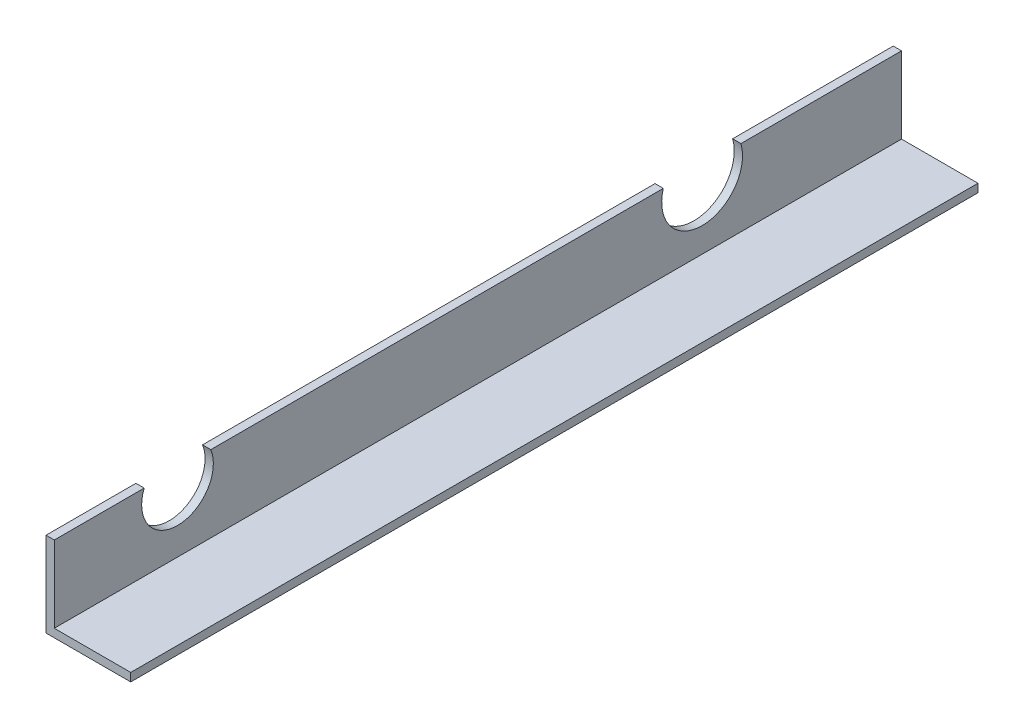
ISO-10303-21;
HEADER;
FILE_DESCRIPTION(('STEP AP214'),'2;1');
FILE_NAME('part.step','',(''),(''),'','','');
FILE_SCHEMA(('AUTOMOTIVE_DESIGN { 1 0 10303 214 1 1 1 1 }'));
ENDSEC;
DATA;
#1=APPLICATION_CONTEXT('core data for automotive mechanical design processes');
#2=APPLICATION_PROTOCOL_DEFINITION('international standard','automotive_design',2000,#1);
#3=PRODUCT_CONTEXT('',#1,'mechanical');
#4=PRODUCT('Part','Part','',(#3));
#5=PRODUCT_RELATED_PRODUCT_CATEGORY('part','',(#4));
#6=PRODUCT_DEFINITION_FORMATION('','',#4);
#7=PRODUCT_DEFINITION_CONTEXT('part definition',#1,'design');
#8=PRODUCT_DEFINITION('design','',#6,#7);
#9=PRODUCT_DEFINITION_SHAPE('','',#8);
#10=(LENGTH_UNIT() NAMED_UNIT(*) SI_UNIT(.MILLI.,.METRE.));
#11=(NAMED_UNIT(*) PLANE_ANGLE_UNIT() SI_UNIT($,.RADIAN.));
#12=(NAMED_UNIT(*) SI_UNIT($,.STERADIAN.) SOLID_ANGLE_UNIT());
#13=UNCERTAINTY_MEASURE_WITH_UNIT(LENGTH_MEASURE(1.E-05),#10,'distance_accuracy_value','');
#14=(GEOMETRIC_REPRESENTATION_CONTEXT(3) GLOBAL_UNCERTAINTY_ASSIGNED_CONTEXT((#13)) GLOBAL_UNIT_ASSIGNED_CONTEXT((#10,
#11,#12)) REPRESENTATION_CONTEXT('',''));
#15=CARTESIAN_POINT('',(0.,0.,0.));
#16=DIRECTION('',(0.,0.,1.));
#17=DIRECTION('',(1.,0.,0.));
#18=AXIS2_PLACEMENT_3D('',#15,#16,#17);
#19=CARTESIAN_POINT('',(6.35,6.35,325.));
#20=DIRECTION('',(-1.,0.,0.));
#21=DIRECTION('',(0.,0.,1.));
#22=AXIS2_PLACEMENT_3D('',#19,#20,#21);
#23=PLANE('',#22);
#24=CARTESIAN_POINT('',(6.34999999999985,56.3500000000004,-172.));
#25=DIRECTION('',(1.,0.,0.));
#26=DIRECTION('',(0.,0.,-1.));
#27=AXIS2_PLACEMENT_3D('',#24,#25,#26);
#28=CIRCLE('',#27,31.);
#29=CARTESIAN_POINT('',(6.34999999999985,65.,-142.231266402482));
#30=VERTEX_POINT('',#29);
#31=CARTESIAN_POINT('',(6.34999999999985,65.,-201.768733597518));
#32=VERTEX_POINT('',#31);
#33=EDGE_CURVE('E108',#30,#32,#28,.T.);
#34=ORIENTED_EDGE('',*,*,#33,.F.);
#35=DIRECTION('',(0.,0.,-1.));
#36=VECTOR('',#35,1.);
#37=CARTESIAN_POINT('',(6.35,65.,325.));
#38=LINE('',#37,#36);
#39=CARTESIAN_POINT('',(6.34999999999986,65.,204.912035308792));
#40=VERTEX_POINT('',#39);
#41=EDGE_CURVE('E126',#40,#30,#38,.T.);
#42=ORIENTED_EDGE('',*,*,#41,.F.);
#43=CARTESIAN_POINT('',(6.34999999999986,54.84176758497,230.467080098466));
#44=DIRECTION('',(1.,0.,0.));
#45=DIRECTION('',(0.,0.,-1.));
#46=AXIS2_PLACEMENT_3D('',#43,#44,#45);
#47=CIRCLE('',#46,27.5);
#48=CARTESIAN_POINT('',(6.34999999999986,65.,256.02212488814));
#49=VERTEX_POINT('',#48);
#50=EDGE_CURVE('E188',#49,#40,#47,.T.);
#51=ORIENTED_EDGE('',*,*,#50,.F.);
#52=CARTESIAN_POINT('',(6.35,65.,325.));
#53=VERTEX_POINT('',#52);
#54=EDGE_CURVE('E129',#53,#49,#38,.T.);
#55=ORIENTED_EDGE('',*,*,#54,.F.);
#56=DIRECTION('',(0.,1.,0.));
#57=VECTOR('',#56,1.);
#58=CARTESIAN_POINT('',(6.35,6.35,325.));
#59=LINE('',#58,#57);
#60=CARTESIAN_POINT('',(6.35,6.35,325.));
#61=VERTEX_POINT('',#60);
#62=EDGE_CURVE('E177',#61,#53,#59,.T.);
#63=ORIENTED_EDGE('',*,*,#62,.F.);
#64=DIRECTION('',(0.,0.,-1.));
#65=VECTOR('',#64,1.);
#66=CARTESIAN_POINT('',(6.35,6.35,325.));
#67=LINE('',#66,#65);
#68=CARTESIAN_POINT('',(6.35,6.35,-325.));
#69=VERTEX_POINT('',#68);
#70=EDGE_CURVE('E135',#61,#69,#67,.T.);
#71=ORIENTED_EDGE('',*,*,#70,.T.);
#72=DIRECTION('',(0.,1.,0.));
#73=VECTOR('',#72,1.);
#74=CARTESIAN_POINT('',(6.35,6.35,-325.));
#75=LINE('',#74,#73);
#76=CARTESIAN_POINT('',(6.35,65.,-325.));
#77=VERTEX_POINT('',#76);
#78=EDGE_CURVE('E124',#69,#77,#75,.T.);
#79=ORIENTED_EDGE('',*,*,#78,.T.);
#80=EDGE_CURVE('E119',#32,#77,#38,.T.);
#81=ORIENTED_EDGE('',*,*,#80,.F.);
#82=EDGE_LOOP('',(#34,#42,#51,#55,#63,#71,#79,#81));
#83=FACE_BOUND('',#82,.T.);
#84=ADVANCED_FACE('F33',(#83),#23,.F.);
#85=CARTESIAN_POINT('',(0.,65.,325.));
#86=DIRECTION('',(0.,-1.,0.));
#87=DIRECTION('',(0.,0.,-1.));
#88=AXIS2_PLACEMENT_3D('',#85,#86,#87);
#89=PLANE('',#88);
#90=DIRECTION('',(0.,0.,-1.));
#91=VECTOR('',#90,1.);
#92=CARTESIAN_POINT('',(0.,65.,325.));
#93=LINE('',#92,#91);
#94=CARTESIAN_POINT('',(0.,65.,-201.768733597518));
#95=VERTEX_POINT('',#94);
#96=CARTESIAN_POINT('',(0.,65.,-325.));
#97=VERTEX_POINT('',#96);
#98=EDGE_CURVE('E121',#95,#97,#93,.T.);
#99=ORIENTED_EDGE('',*,*,#98,.F.);
#100=DIRECTION('',(1.,0.,0.));
#101=VECTOR('',#100,1.);
#102=CARTESIAN_POINT('',(6.34999999999986,65.,-201.768733597518));
#103=LINE('',#102,#101);
#104=EDGE_CURVE('E11',#95,#32,#103,.T.);
#105=ORIENTED_EDGE('',*,*,#104,.T.);
#106=ORIENTED_EDGE('',*,*,#80,.T.);
#107=DIRECTION('',(-1.,0.,0.));
#108=VECTOR('',#107,1.);
#109=CARTESIAN_POINT('',(0.,65.,-325.));
#110=LINE('',#109,#108);
#111=EDGE_CURVE('E164',#77,#97,#110,.T.);
#112=ORIENTED_EDGE('',*,*,#111,.T.);
#113=EDGE_LOOP('',(#99,#105,#106,#112));
#114=FACE_BOUND('',#113,.T.);
#115=ADVANCED_FACE('F117',(#114),#89,.F.);
#116=ORIENTED_EDGE('',*,*,#41,.T.);
#117=DIRECTION('',(1.,0.,0.));
#118=VECTOR('',#117,1.);
#119=CARTESIAN_POINT('',(6.34999999999986,65.,-142.231266402482));
#120=LINE('',#119,#118);
#121=CARTESIAN_POINT('',(0.,65.,-142.231266402482));
#122=VERTEX_POINT('',#121);
#123=EDGE_CURVE('E41',#30,#122,#120,.F.);
#124=ORIENTED_EDGE('',*,*,#123,.T.);
#125=CARTESIAN_POINT('',(0.,65.,204.912035308792));
#126=VERTEX_POINT('',#125);
#127=EDGE_CURVE('E131',#126,#122,#93,.T.);
#128=ORIENTED_EDGE('',*,*,#127,.F.);
#129=DIRECTION('',(1.,0.,0.));
#130=VECTOR('',#129,1.);
#131=CARTESIAN_POINT('',(-23.6500000000001,65.,204.912035308792));
#132=LINE('',#131,#130);
#133=EDGE_CURVE('E56',#126,#40,#132,.T.);
#134=ORIENTED_EDGE('',*,*,#133,.T.);
#135=EDGE_LOOP('',(#116,#124,#128,#134));
#136=FACE_BOUND('',#135,.T.);
#137=ADVANCED_FACE('F153',(#136),#89,.F.);
#138=CARTESIAN_POINT('',(0.,0.,325.));
#139=DIRECTION('',(0.,1.,0.));
#140=DIRECTION('',(0.,0.,1.));
#141=AXIS2_PLACEMENT_3D('',#138,#139,#140);
#142=PLANE('',#141);
#143=DIRECTION('',(1.,0.,0.));
#144=VECTOR('',#143,1.);
#145=CARTESIAN_POINT('',(0.,0.,-325.));
#146=LINE('',#145,#144);
#147=CARTESIAN_POINT('',(0.,0.,-325.));
#148=VERTEX_POINT('',#147);
#149=CARTESIAN_POINT('',(65.,0.,-325.));
#150=VERTEX_POINT('',#149);
#151=EDGE_CURVE('E171',#148,#150,#146,.T.);
#152=ORIENTED_EDGE('',*,*,#151,.T.);
#153=DIRECTION('',(0.,0.,-1.));
#154=VECTOR('',#153,1.);
#155=CARTESIAN_POINT('',(65.,0.,325.));
#156=LINE('',#155,#154);
#157=CARTESIAN_POINT('',(65.,0.,325.));
#158=VERTEX_POINT('',#157);
#159=EDGE_CURVE('E144',#158,#150,#156,.T.);
#160=ORIENTED_EDGE('',*,*,#159,.F.);
#161=DIRECTION('',(1.,0.,0.));
#162=VECTOR('',#161,1.);
#163=CARTESIAN_POINT('',(0.,0.,325.));
#164=LINE('',#163,#162);
#165=CARTESIAN_POINT('',(0.,0.,325.));
#166=VERTEX_POINT('',#165);
#167=EDGE_CURVE('E163',#166,#158,#164,.T.);
#168=ORIENTED_EDGE('',*,*,#167,.F.);
#169=DIRECTION('',(0.,0.,-1.));
#170=VECTOR('',#169,1.);
#171=CARTESIAN_POINT('',(0.,0.,325.));
#172=LINE('',#171,#170);
#173=EDGE_CURVE('E156',#166,#148,#172,.T.);
#174=ORIENTED_EDGE('',*,*,#173,.T.);
#175=EDGE_LOOP('',(#152,#160,#168,#174));
#176=FACE_BOUND('',#175,.T.);
#177=ADVANCED_FACE('F35',(#176),#142,.F.);
#178=CARTESIAN_POINT('',(65.,0.,325.));
#179=DIRECTION('',(-1.,0.,0.));
#180=DIRECTION('',(0.,0.,1.));
#181=AXIS2_PLACEMENT_3D('',#178,#179,#180);
#182=PLANE('',#181);
#183=DIRECTION('',(0.,1.,0.));
#184=VECTOR('',#183,1.);
#185=CARTESIAN_POINT('',(65.,0.,-325.));
#186=LINE('',#185,#184);
#187=CARTESIAN_POINT('',(65.,6.35,-325.));
#188=VERTEX_POINT('',#187);
#189=EDGE_CURVE('E169',#150,#188,#186,.T.);
#190=ORIENTED_EDGE('',*,*,#189,.T.);
#191=DIRECTION('',(0.,0.,-1.));
#192=VECTOR('',#191,1.);
#193=CARTESIAN_POINT('',(65.,6.35,325.));
#194=LINE('',#193,#192);
#195=CARTESIAN_POINT('',(65.,6.35,325.));
#196=VERTEX_POINT('',#195);
#197=EDGE_CURVE('E140',#196,#188,#194,.T.);
#198=ORIENTED_EDGE('',*,*,#197,.F.);
#199=DIRECTION('',(0.,1.,0.));
#200=VECTOR('',#199,1.);
#201=CARTESIAN_POINT('',(65.,0.,325.));
#202=LINE('',#201,#200);
#203=EDGE_CURVE('E181',#158,#196,#202,.T.);
#204=ORIENTED_EDGE('',*,*,#203,.F.);
#205=ORIENTED_EDGE('',*,*,#159,.T.);
#206=EDGE_LOOP('',(#190,#198,#204,#205));
#207=FACE_BOUND('',#206,.T.);
#208=ADVANCED_FACE('F211',(#207),#182,.F.);
#209=CARTESIAN_POINT('',(6.35,6.35,325.));
#210=DIRECTION('',(0.,-1.,0.));
#211=DIRECTION('',(0.,0.,-1.));
#212=AXIS2_PLACEMENT_3D('',#209,#210,#211);
#213=PLANE('',#212);
#214=DIRECTION('',(-1.,0.,0.));
#215=VECTOR('',#214,1.);
#216=CARTESIAN_POINT('',(6.35,6.35,-325.));
#217=LINE('',#216,#215);
#218=EDGE_CURVE('E167',#188,#69,#217,.T.);
#219=ORIENTED_EDGE('',*,*,#218,.T.);
#220=ORIENTED_EDGE('',*,*,#70,.F.);
#221=DIRECTION('',(-1.,0.,0.));
#222=VECTOR('',#221,1.);
#223=CARTESIAN_POINT('',(6.35,6.35,325.));
#224=LINE('',#223,#222);
#225=EDGE_CURVE('E179',#196,#61,#224,.T.);
#226=ORIENTED_EDGE('',*,*,#225,.F.);
#227=ORIENTED_EDGE('',*,*,#197,.T.);
#228=EDGE_LOOP('',(#219,#220,#226,#227));
#229=FACE_BOUND('',#228,.T.);
#230=ADVANCED_FACE('F201',(#229),#213,.F.);
#231=ORIENTED_EDGE('',*,*,#54,.T.);
#232=DIRECTION('',(1.,0.,0.));
#233=VECTOR('',#232,1.);
#234=CARTESIAN_POINT('',(-23.6500000000001,65.,256.02212488814));
#235=LINE('',#234,#233);
#236=CARTESIAN_POINT('',(0.,65.,256.02212488814));
#237=VERTEX_POINT('',#236);
#238=EDGE_CURVE('E186',#49,#237,#235,.F.);
#239=ORIENTED_EDGE('',*,*,#238,.T.);
#240=CARTESIAN_POINT('',(0.,65.,325.));
#241=VERTEX_POINT('',#240);
#242=EDGE_CURVE('E127',#241,#237,#93,.T.);
#243=ORIENTED_EDGE('',*,*,#242,.F.);
#244=DIRECTION('',(-1.,0.,0.));
#245=VECTOR('',#244,1.);
#246=CARTESIAN_POINT('',(0.,65.,325.));
#247=LINE('',#246,#245);
#248=EDGE_CURVE('E175',#53,#241,#247,.T.);
#249=ORIENTED_EDGE('',*,*,#248,.F.);
#250=EDGE_LOOP('',(#231,#239,#243,#249));
#251=FACE_BOUND('',#250,.T.);
#252=ADVANCED_FACE('F193',(#251),#89,.F.);
#253=CARTESIAN_POINT('',(0.,0.,325.));
#254=DIRECTION('',(1.,0.,0.));
#255=DIRECTION('',(0.,0.,-1.));
#256=AXIS2_PLACEMENT_3D('',#253,#254,#255);
#257=PLANE('',#256);
#258=ORIENTED_EDGE('',*,*,#127,.T.);
#259=CARTESIAN_POINT('',(0.,56.3500000000004,-172.));
#260=DIRECTION('',(1.,0.,0.));
#261=DIRECTION('',(0.,0.,-1.));
#262=AXIS2_PLACEMENT_3D('',#259,#260,#261);
#263=CIRCLE('',#262,31.);
#264=EDGE_CURVE('E48',#122,#95,#263,.T.);
#265=ORIENTED_EDGE('',*,*,#264,.T.);
#266=ORIENTED_EDGE('',*,*,#98,.T.);
#267=DIRECTION('',(0.,-1.,0.));
#268=VECTOR('',#267,1.);
#269=CARTESIAN_POINT('',(0.,0.,-325.));
#270=LINE('',#269,#268);
#271=EDGE_CURVE('E161',#97,#148,#270,.T.);
#272=ORIENTED_EDGE('',*,*,#271,.T.);
#273=ORIENTED_EDGE('',*,*,#173,.F.);
#274=DIRECTION('',(0.,-1.,0.));
#275=VECTOR('',#274,1.);
#276=CARTESIAN_POINT('',(0.,0.,325.));
#277=LINE('',#276,#275);
#278=EDGE_CURVE('E160',#241,#166,#277,.T.);
#279=ORIENTED_EDGE('',*,*,#278,.F.);
#280=ORIENTED_EDGE('',*,*,#242,.T.);
#281=CARTESIAN_POINT('',(0.,54.84176758497,230.467080098466));
#282=DIRECTION('',(1.,0.,0.));
#283=DIRECTION('',(0.,0.,-1.));
#284=AXIS2_PLACEMENT_3D('',#281,#282,#283);
#285=CIRCLE('',#284,27.5);
#286=EDGE_CURVE('E149',#237,#126,#285,.T.);
#287=ORIENTED_EDGE('',*,*,#286,.T.);
#288=EDGE_LOOP('',(#258,#265,#266,#272,#273,#279,#280,#287));
#289=FACE_BOUND('',#288,.T.);
#290=ADVANCED_FACE('F155',(#289),#257,.F.);
#291=CARTESIAN_POINT('',(0.,0.,325.));
#292=DIRECTION('',(0.,0.,1.));
#293=DIRECTION('',(1.,0.,0.));
#294=AXIS2_PLACEMENT_3D('',#291,#292,#293);
#295=PLANE('',#294);
#296=ORIENTED_EDGE('',*,*,#167,.T.);
#297=ORIENTED_EDGE('',*,*,#203,.T.);
#298=ORIENTED_EDGE('',*,*,#225,.T.);
#299=ORIENTED_EDGE('',*,*,#62,.T.);
#300=ORIENTED_EDGE('',*,*,#248,.T.);
#301=ORIENTED_EDGE('',*,*,#278,.T.);
#302=EDGE_LOOP('',(#296,#297,#298,#299,#300,#301));
#303=FACE_BOUND('',#302,.T.);
#304=ADVANCED_FACE('F196',(#303),#295,.T.);
#305=CARTESIAN_POINT('',(0.,0.,-325.));
#306=DIRECTION('',(0.,0.,1.));
#307=DIRECTION('',(1.,0.,0.));
#308=AXIS2_PLACEMENT_3D('',#305,#306,#307);
#309=PLANE('',#308);
#310=ORIENTED_EDGE('',*,*,#151,.F.);
#311=ORIENTED_EDGE('',*,*,#271,.F.);
#312=ORIENTED_EDGE('',*,*,#111,.F.);
#313=ORIENTED_EDGE('',*,*,#78,.F.);
#314=ORIENTED_EDGE('',*,*,#218,.F.);
#315=ORIENTED_EDGE('',*,*,#189,.F.);
#316=EDGE_LOOP('',(#310,#311,#312,#313,#314,#315));
#317=FACE_BOUND('',#316,.T.);
#318=ADVANCED_FACE('F205',(#317),#309,.F.);
#319=CARTESIAN_POINT('',(-23.6500000000001,54.84176758497,230.467080098466));
#320=DIRECTION('',(1.,0.,0.));
#321=DIRECTION('',(0.,0.,-1.));
#322=AXIS2_PLACEMENT_3D('',#319,#320,#321);
#323=CYLINDRICAL_SURFACE('',#322,27.5);
#324=ORIENTED_EDGE('',*,*,#286,.F.);
#325=ORIENTED_EDGE('',*,*,#238,.F.);
#326=ORIENTED_EDGE('',*,*,#50,.T.);
#327=ORIENTED_EDGE('',*,*,#133,.F.);
#328=EDGE_LOOP('',(#324,#325,#326,#327));
#329=FACE_BOUND('',#328,.T.);
#330=ADVANCED_FACE('F191',(#329),#323,.F.);
#331=CARTESIAN_POINT('',(6.34999999999986,56.3500000000004,-172.));
#332=DIRECTION('',(1.,0.,0.));
#333=DIRECTION('',(0.,0.,-1.));
#334=AXIS2_PLACEMENT_3D('',#331,#332,#333);
#335=CYLINDRICAL_SURFACE('',#334,31.);
#336=ORIENTED_EDGE('',*,*,#264,.F.);
#337=ORIENTED_EDGE('',*,*,#123,.F.);
#338=ORIENTED_EDGE('',*,*,#33,.T.);
#339=ORIENTED_EDGE('',*,*,#104,.F.);
#340=EDGE_LOOP('',(#336,#337,#338,#339));
#341=FACE_BOUND('',#340,.T.);
#342=ADVANCED_FACE('F109',(#341),#335,.F.);
#343=CLOSED_SHELL('',(#84,#115,#137,#177,#208,#230,#252,#290,#304,#318,#330,#342));
#344=MANIFOLD_SOLID_BREP('B2',#343);
#345=ADVANCED_BREP_SHAPE_REPRESENTATION('',(#18,#344),#14);
#346=SHAPE_DEFINITION_REPRESENTATION(#9,#345);
ENDSEC;
END-ISO-10303-21;
